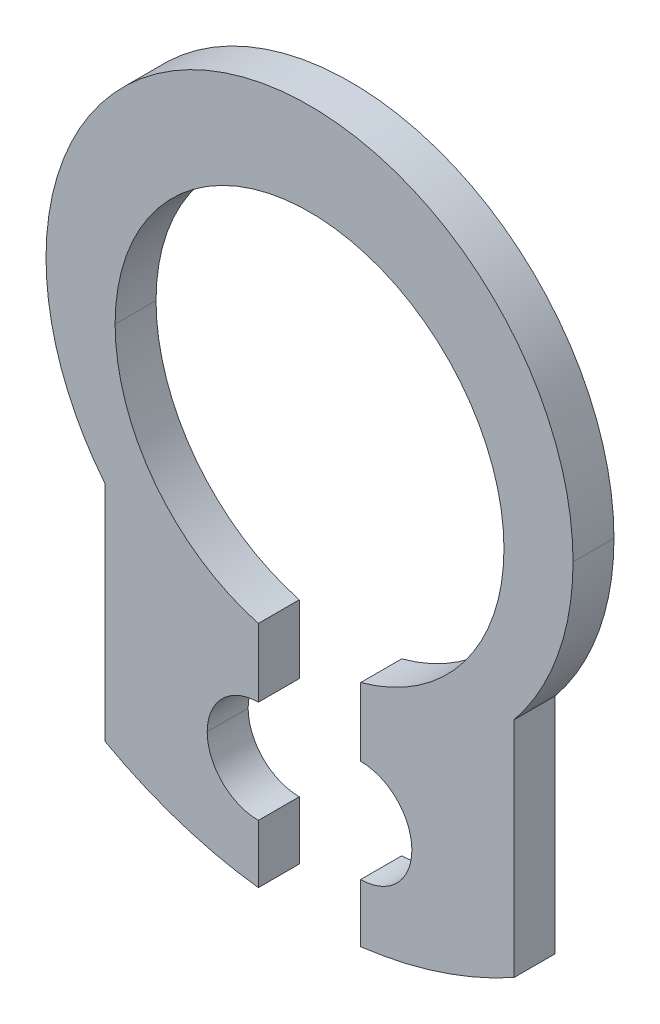
ISO-10303-21;
HEADER;
FILE_DESCRIPTION(('STEP AP214'),'2;1');
FILE_NAME('part.step','',(''),(''),'','','');
FILE_SCHEMA(('AUTOMOTIVE_DESIGN { 1 0 10303 214 1 1 1 1 }'));
ENDSEC;
DATA;
#1=APPLICATION_CONTEXT('core data for automotive mechanical design processes');
#2=APPLICATION_PROTOCOL_DEFINITION('international standard','automotive_design',2000,#1);
#3=PRODUCT_CONTEXT('',#1,'mechanical');
#4=PRODUCT('Part','Part','',(#3));
#5=PRODUCT_RELATED_PRODUCT_CATEGORY('part','',(#4));
#6=PRODUCT_DEFINITION_FORMATION('','',#4);
#7=PRODUCT_DEFINITION_CONTEXT('part definition',#1,'design');
#8=PRODUCT_DEFINITION('design','',#6,#7);
#9=PRODUCT_DEFINITION_SHAPE('','',#8);
#10=(LENGTH_UNIT() NAMED_UNIT(*) SI_UNIT(.MILLI.,.METRE.));
#11=(NAMED_UNIT(*) PLANE_ANGLE_UNIT() SI_UNIT($,.RADIAN.));
#12=(NAMED_UNIT(*) SI_UNIT($,.STERADIAN.) SOLID_ANGLE_UNIT());
#13=UNCERTAINTY_MEASURE_WITH_UNIT(LENGTH_MEASURE(1.E-05),#10,'distance_accuracy_value','');
#14=(GEOMETRIC_REPRESENTATION_CONTEXT(3) GLOBAL_UNCERTAINTY_ASSIGNED_CONTEXT((#13)) GLOBAL_UNIT_ASSIGNED_CONTEXT((#10,
#11,#12)) REPRESENTATION_CONTEXT('',''));
#15=CARTESIAN_POINT('',(0.,0.,0.));
#16=DIRECTION('',(0.,0.,1.));
#17=DIRECTION('',(1.,0.,0.));
#18=AXIS2_PLACEMENT_3D('',#15,#16,#17);
#19=CARTESIAN_POINT('',(0.,0.225,0.));
#20=DIRECTION('',(0.,0.,1.));
#21=DIRECTION('',(1.,0.,0.));
#22=AXIS2_PLACEMENT_3D('',#19,#20,#21);
#23=CYLINDRICAL_SURFACE('',#22,2.575);
#24=DIRECTION('',(0.,0.,1.));
#25=VECTOR('',#24,1.);
#26=CARTESIAN_POINT('',(2.575,0.225,0.));
#27=LINE('',#26,#25);
#28=CARTESIAN_POINT('',(2.575,0.225,0.));
#29=VERTEX_POINT('',#28);
#30=CARTESIAN_POINT('',(2.575,0.225,0.4));
#31=VERTEX_POINT('',#30);
#32=EDGE_CURVE('E373',#29,#31,#27,.T.);
#33=ORIENTED_EDGE('',*,*,#32,.T.);
#34=CARTESIAN_POINT('',(0.,0.225,0.4));
#35=DIRECTION('',(0.,0.,-1.));
#36=DIRECTION('',(1.,0.,0.));
#37=AXIS2_PLACEMENT_3D('',#34,#35,#36);
#38=CIRCLE('',#37,2.575);
#39=CARTESIAN_POINT('',(2.,-1.39692015833086,0.4));
#40=VERTEX_POINT('',#39);
#41=EDGE_CURVE('E245',#31,#40,#38,.T.);
#42=ORIENTED_EDGE('',*,*,#41,.T.);
#43=DIRECTION('',(0.,0.,1.));
#44=VECTOR('',#43,1.);
#45=CARTESIAN_POINT('',(2.,-1.39692015833086,0.));
#46=LINE('',#45,#44);
#47=CARTESIAN_POINT('',(2.,-1.39692015833086,0.));
#48=VERTEX_POINT('',#47);
#49=EDGE_CURVE('E24',#48,#40,#46,.T.);
#50=ORIENTED_EDGE('',*,*,#49,.F.);
#51=CARTESIAN_POINT('',(0.,0.225,0.));
#52=DIRECTION('',(0.,0.,1.));
#53=DIRECTION('',(1.,0.,0.));
#54=AXIS2_PLACEMENT_3D('',#51,#52,#53);
#55=CIRCLE('',#54,2.575);
#56=EDGE_CURVE('E326',#48,#29,#55,.T.);
#57=ORIENTED_EDGE('',*,*,#56,.T.);
#58=EDGE_LOOP('',(#33,#42,#50,#57));
#59=FACE_BOUND('',#58,.T.);
#60=ADVANCED_FACE('F16',(#59),#23,.T.);
#61=CARTESIAN_POINT('',(-2.,-2.48801309598276,0.));
#62=DIRECTION('',(-1.,0.,0.));
#63=DIRECTION('',(0.,1.,0.));
#64=AXIS2_PLACEMENT_3D('',#61,#62,#63);
#65=PLANE('',#64);
#66=DIRECTION('',(0.,1.,0.));
#67=VECTOR('',#66,1.);
#68=CARTESIAN_POINT('',(-2.,-3.57910603363466,0.4));
#69=LINE('',#68,#67);
#70=CARTESIAN_POINT('',(-2.,-3.57910603363466,0.4));
#71=VERTEX_POINT('',#70);
#72=CARTESIAN_POINT('',(-2.,-1.39692015833086,0.4));
#73=VERTEX_POINT('',#72);
#74=EDGE_CURVE('E241',#71,#73,#69,.T.);
#75=ORIENTED_EDGE('',*,*,#74,.T.);
#76=DIRECTION('',(0.,0.,1.));
#77=VECTOR('',#76,1.);
#78=CARTESIAN_POINT('',(-2.,-1.39692015833086,0.));
#79=LINE('',#78,#77);
#80=CARTESIAN_POINT('',(-2.,-1.39692015833086,0.));
#81=VERTEX_POINT('',#80);
#82=EDGE_CURVE('E377',#81,#73,#79,.T.);
#83=ORIENTED_EDGE('',*,*,#82,.F.);
#84=DIRECTION('',(0.,1.,0.));
#85=VECTOR('',#84,1.);
#86=CARTESIAN_POINT('',(-2.,-3.57910603363466,0.));
#87=LINE('',#86,#85);
#88=CARTESIAN_POINT('',(-2.,-3.57910603363466,0.));
#89=VERTEX_POINT('',#88);
#90=EDGE_CURVE('E253',#89,#81,#87,.T.);
#91=ORIENTED_EDGE('',*,*,#90,.F.);
#92=DIRECTION('',(0.,0.,1.));
#93=VECTOR('',#92,1.);
#94=CARTESIAN_POINT('',(-2.,-3.57910603363466,0.));
#95=LINE('',#94,#93);
#96=EDGE_CURVE('E10',#89,#71,#95,.T.);
#97=ORIENTED_EDGE('',*,*,#96,.T.);
#98=EDGE_LOOP('',(#75,#83,#91,#97));
#99=FACE_BOUND('',#98,.T.);
#100=ADVANCED_FACE('F456',(#99),#65,.T.);
#101=CARTESIAN_POINT('',(0.,0.,0.));
#102=DIRECTION('',(0.,0.,1.));
#103=DIRECTION('',(1.,0.,0.));
#104=AXIS2_PLACEMENT_3D('',#101,#102,#103);
#105=CYLINDRICAL_SURFACE('',#104,4.1);
#106=DIRECTION('',(0.,0.,1.));
#107=VECTOR('',#106,1.);
#108=CARTESIAN_POINT('',(-0.5,-4.06939798987516,0.2));
#109=LINE('',#108,#107);
#110=CARTESIAN_POINT('',(-0.5,-4.06939798987516,0.));
#111=VERTEX_POINT('',#110);
#112=CARTESIAN_POINT('',(-0.5,-4.06939798987516,0.4));
#113=VERTEX_POINT('',#112);
#114=EDGE_CURVE('E335',#111,#113,#109,.T.);
#115=ORIENTED_EDGE('',*,*,#114,.T.);
#116=CARTESIAN_POINT('',(0.,0.,0.4));
#117=DIRECTION('',(0.,0.,-1.));
#118=DIRECTION('',(1.,0.,0.));
#119=AXIS2_PLACEMENT_3D('',#116,#117,#118);
#120=CIRCLE('',#119,4.1);
#121=EDGE_CURVE('E244',#113,#71,#120,.T.);
#122=ORIENTED_EDGE('',*,*,#121,.T.);
#123=ORIENTED_EDGE('',*,*,#96,.F.);
#124=CARTESIAN_POINT('',(0.,0.,0.));
#125=DIRECTION('',(0.,0.,1.));
#126=DIRECTION('',(1.,0.,0.));
#127=AXIS2_PLACEMENT_3D('',#124,#125,#126);
#128=CIRCLE('',#127,4.1);
#129=EDGE_CURVE('E249',#89,#111,#128,.T.);
#130=ORIENTED_EDGE('',*,*,#129,.T.);
#131=EDGE_LOOP('',(#115,#122,#123,#130));
#132=FACE_BOUND('',#131,.T.);
#133=ADVANCED_FACE('F453',(#132),#105,.T.);
#134=CARTESIAN_POINT('',(2.,-2.48801309598276,0.));
#135=DIRECTION('',(1.,0.,0.));
#136=DIRECTION('',(0.,1.,0.));
#137=AXIS2_PLACEMENT_3D('',#134,#135,#136);
#138=PLANE('',#137);
#139=DIRECTION('',(0.,-1.,0.));
#140=VECTOR('',#139,1.);
#141=CARTESIAN_POINT('',(2.,-3.57910603363466,0.4));
#142=LINE('',#141,#140);
#143=CARTESIAN_POINT('',(2.,-3.57910603363465,0.4));
#144=VERTEX_POINT('',#143);
#145=EDGE_CURVE('E290',#40,#144,#142,.T.);
#146=ORIENTED_EDGE('',*,*,#145,.T.);
#147=DIRECTION('',(0.,0.,1.));
#148=VECTOR('',#147,1.);
#149=CARTESIAN_POINT('',(2.,-3.57910603363465,0.));
#150=LINE('',#149,#148);
#151=CARTESIAN_POINT('',(2.,-3.57910603363465,0.));
#152=VERTEX_POINT('',#151);
#153=EDGE_CURVE('E36',#152,#144,#150,.T.);
#154=ORIENTED_EDGE('',*,*,#153,.F.);
#155=DIRECTION('',(0.,1.,0.));
#156=VECTOR('',#155,1.);
#157=CARTESIAN_POINT('',(2.,-3.57910603363466,0.));
#158=LINE('',#157,#156);
#159=EDGE_CURVE('E329',#152,#48,#158,.T.);
#160=ORIENTED_EDGE('',*,*,#159,.T.);
#161=ORIENTED_EDGE('',*,*,#49,.T.);
#162=EDGE_LOOP('',(#146,#154,#160,#161));
#163=FACE_BOUND('',#162,.T.);
#164=ADVANCED_FACE('F445',(#163),#138,.T.);
#165=CARTESIAN_POINT('',(0.,0.,0.));
#166=DIRECTION('',(0.,0.,1.));
#167=DIRECTION('',(1.,0.,0.));
#168=AXIS2_PLACEMENT_3D('',#165,#166,#167);
#169=CYLINDRICAL_SURFACE('',#168,4.1);
#170=DIRECTION('',(0.,0.,-1.));
#171=VECTOR('',#170,1.);
#172=CARTESIAN_POINT('',(0.5,-4.06939798987516,0.2));
#173=LINE('',#172,#171);
#174=CARTESIAN_POINT('',(0.5,-4.06939798987516,0.4));
#175=VERTEX_POINT('',#174);
#176=CARTESIAN_POINT('',(0.5,-4.06939798987516,0.));
#177=VERTEX_POINT('',#176);
#178=EDGE_CURVE('E309',#175,#177,#173,.T.);
#179=ORIENTED_EDGE('',*,*,#178,.T.);
#180=CARTESIAN_POINT('',(0.,0.,0.));
#181=DIRECTION('',(0.,0.,1.));
#182=DIRECTION('',(1.,0.,0.));
#183=AXIS2_PLACEMENT_3D('',#180,#181,#182);
#184=CIRCLE('',#183,4.1);
#185=EDGE_CURVE('E332',#177,#152,#184,.T.);
#186=ORIENTED_EDGE('',*,*,#185,.T.);
#187=ORIENTED_EDGE('',*,*,#153,.T.);
#188=CARTESIAN_POINT('',(0.,0.,0.4));
#189=DIRECTION('',(0.,0.,-1.));
#190=DIRECTION('',(1.,0.,0.));
#191=AXIS2_PLACEMENT_3D('',#188,#189,#190);
#192=CIRCLE('',#191,4.1);
#193=EDGE_CURVE('E286',#144,#175,#192,.T.);
#194=ORIENTED_EDGE('',*,*,#193,.T.);
#195=EDGE_LOOP('',(#179,#186,#187,#194));
#196=FACE_BOUND('',#195,.T.);
#197=ADVANCED_FACE('F443',(#196),#169,.T.);
#198=CARTESIAN_POINT('',(0.,0.,0.2));
#199=DIRECTION('',(0.,0.,1.));
#200=DIRECTION('',(1.,0.,0.));
#201=AXIS2_PLACEMENT_3D('',#198,#199,#200);
#202=CYLINDRICAL_SURFACE('',#201,1.9);
#203=DIRECTION('',(0.,0.,-1.));
#204=VECTOR('',#203,1.);
#205=CARTESIAN_POINT('',(1.9,0.,0.2));
#206=LINE('',#205,#204);
#207=CARTESIAN_POINT('',(1.9,0.,0.4));
#208=VERTEX_POINT('',#207);
#209=CARTESIAN_POINT('',(1.9,0.,0.));
#210=VERTEX_POINT('',#209);
#211=EDGE_CURVE('E240',#208,#210,#206,.T.);
#212=ORIENTED_EDGE('',*,*,#211,.T.);
#213=CARTESIAN_POINT('',(0.,0.,0.));
#214=DIRECTION('',(0.,0.,1.));
#215=DIRECTION('',(1.,0.,0.));
#216=AXIS2_PLACEMENT_3D('',#213,#214,#215);
#217=CIRCLE('',#216,1.9);
#218=CARTESIAN_POINT('',(0.5,-1.83303027798234,0.));
#219=VERTEX_POINT('',#218);
#220=EDGE_CURVE('E317',#219,#210,#217,.T.);
#221=ORIENTED_EDGE('',*,*,#220,.F.);
#222=DIRECTION('',(0.,0.,1.));
#223=VECTOR('',#222,1.);
#224=CARTESIAN_POINT('',(0.5,-1.83303027798234,0.2));
#225=LINE('',#224,#223);
#226=CARTESIAN_POINT('',(0.5,-1.83303027798234,0.4));
#227=VERTEX_POINT('',#226);
#228=EDGE_CURVE('E337',#219,#227,#225,.T.);
#229=ORIENTED_EDGE('',*,*,#228,.T.);
#230=CARTESIAN_POINT('',(0.,0.,0.4));
#231=DIRECTION('',(0.,0.,-1.));
#232=DIRECTION('',(1.,0.,0.));
#233=AXIS2_PLACEMENT_3D('',#230,#231,#232);
#234=CIRCLE('',#233,1.9);
#235=EDGE_CURVE('E274',#208,#227,#234,.T.);
#236=ORIENTED_EDGE('',*,*,#235,.F.);
#237=EDGE_LOOP('',(#212,#221,#229,#236));
#238=FACE_BOUND('',#237,.T.);
#239=ADVANCED_FACE('F426',(#238),#202,.F.);
#240=CARTESIAN_POINT('',(0.5,-2.875,0.2));
#241=DIRECTION('',(-1.,0.,0.));
#242=DIRECTION('',(0.,0.,1.));
#243=AXIS2_PLACEMENT_3D('',#240,#241,#242);
#244=PLANE('',#243);
#245=DIRECTION('',(0.,0.,1.));
#246=VECTOR('',#245,1.);
#247=CARTESIAN_POINT('',(0.5,-2.5,0.2));
#248=LINE('',#247,#246);
#249=CARTESIAN_POINT('',(0.5,-2.5,0.));
#250=VERTEX_POINT('',#249);
#251=CARTESIAN_POINT('',(0.5,-2.5,0.4));
#252=VERTEX_POINT('',#251);
#253=EDGE_CURVE('E267',#250,#252,#248,.T.);
#254=ORIENTED_EDGE('',*,*,#253,.T.);
#255=DIRECTION('',(0.,-1.,0.));
#256=VECTOR('',#255,1.);
#257=CARTESIAN_POINT('',(0.5,-1.85976178352986,0.4));
#258=LINE('',#257,#256);
#259=EDGE_CURVE('E270',#227,#252,#258,.T.);
#260=ORIENTED_EDGE('',*,*,#259,.F.);
#261=ORIENTED_EDGE('',*,*,#228,.F.);
#262=DIRECTION('',(0.,1.,0.));
#263=VECTOR('',#262,1.);
#264=CARTESIAN_POINT('',(0.5,-1.85976178352986,0.));
#265=LINE('',#264,#263);
#266=EDGE_CURVE('E312',#250,#219,#265,.T.);
#267=ORIENTED_EDGE('',*,*,#266,.F.);
#268=EDGE_LOOP('',(#254,#260,#261,#267));
#269=FACE_BOUND('',#268,.T.);
#270=ADVANCED_FACE('F431',(#269),#244,.T.);
#271=CARTESIAN_POINT('',(-0.5,-2.875,0.2));
#272=DIRECTION('',(1.,0.,0.));
#273=DIRECTION('',(0.,1.,0.));
#274=AXIS2_PLACEMENT_3D('',#271,#272,#273);
#275=PLANE('',#274);
#276=DIRECTION('',(0.,0.,-1.));
#277=VECTOR('',#276,1.);
#278=CARTESIAN_POINT('',(-0.5,-2.5,0.2));
#279=LINE('',#278,#277);
#280=CARTESIAN_POINT('',(-0.5,-2.5,0.4));
#281=VERTEX_POINT('',#280);
#282=CARTESIAN_POINT('',(-0.5,-2.5,0.));
#283=VERTEX_POINT('',#282);
#284=EDGE_CURVE('E203',#281,#283,#279,.T.);
#285=ORIENTED_EDGE('',*,*,#284,.T.);
#286=DIRECTION('',(0.,-1.,0.));
#287=VECTOR('',#286,1.);
#288=CARTESIAN_POINT('',(-0.5,-1.85976178352986,0.));
#289=LINE('',#288,#287);
#290=CARTESIAN_POINT('',(-0.5,-1.83303027798234,0.));
#291=VERTEX_POINT('',#290);
#292=EDGE_CURVE('E320',#291,#283,#289,.T.);
#293=ORIENTED_EDGE('',*,*,#292,.F.);
#294=DIRECTION('',(0.,0.,-1.));
#295=VECTOR('',#294,1.);
#296=CARTESIAN_POINT('',(-0.5,-1.83303027798234,0.2));
#297=LINE('',#296,#295);
#298=CARTESIAN_POINT('',(-0.5,-1.83303027798234,0.4));
#299=VERTEX_POINT('',#298);
#300=EDGE_CURVE('E227',#299,#291,#297,.T.);
#301=ORIENTED_EDGE('',*,*,#300,.F.);
#302=DIRECTION('',(0.,1.,0.));
#303=VECTOR('',#302,1.);
#304=CARTESIAN_POINT('',(-0.5,-1.85976178352986,0.4));
#305=LINE('',#304,#303);
#306=EDGE_CURVE('E195',#281,#299,#305,.T.);
#307=ORIENTED_EDGE('',*,*,#306,.F.);
#308=EDGE_LOOP('',(#285,#293,#301,#307));
#309=FACE_BOUND('',#308,.T.);
#310=ADVANCED_FACE('F416',(#309),#275,.T.);
#311=CARTESIAN_POINT('',(-0.5,-2.875,0.2));
#312=DIRECTION('',(1.,0.,0.));
#313=DIRECTION('',(0.,1.,0.));
#314=AXIS2_PLACEMENT_3D('',#311,#312,#313);
#315=PLANE('',#314);
#316=DIRECTION('',(0.,0.,1.));
#317=VECTOR('',#316,1.);
#318=CARTESIAN_POINT('',(-0.5,-3.5,0.2));
#319=LINE('',#318,#317);
#320=CARTESIAN_POINT('',(-0.5,-3.5,0.));
#321=VERTEX_POINT('',#320);
#322=CARTESIAN_POINT('',(-0.5,-3.5,0.4));
#323=VERTEX_POINT('',#322);
#324=EDGE_CURVE('E313',#321,#323,#319,.T.);
#325=ORIENTED_EDGE('',*,*,#324,.T.);
#326=DIRECTION('',(0.,1.,0.));
#327=VECTOR('',#326,1.);
#328=CARTESIAN_POINT('',(-0.5,-1.85976178352986,0.4));
#329=LINE('',#328,#327);
#330=EDGE_CURVE('E190',#113,#323,#329,.T.);
#331=ORIENTED_EDGE('',*,*,#330,.F.);
#332=ORIENTED_EDGE('',*,*,#114,.F.);
#333=DIRECTION('',(0.,-1.,0.));
#334=VECTOR('',#333,1.);
#335=CARTESIAN_POINT('',(-0.5,-1.85976178352986,0.));
#336=LINE('',#335,#334);
#337=EDGE_CURVE('E254',#321,#111,#336,.T.);
#338=ORIENTED_EDGE('',*,*,#337,.F.);
#339=EDGE_LOOP('',(#325,#331,#332,#338));
#340=FACE_BOUND('',#339,.T.);
#341=ADVANCED_FACE('F413',(#340),#315,.T.);
#342=CARTESIAN_POINT('',(0.,-0.844523567059723,0.));
#343=DIRECTION('',(0.,0.,1.));
#344=DIRECTION('',(1.,0.,0.));
#345=AXIS2_PLACEMENT_3D('',#342,#343,#344);
#346=PLANE('',#345);
#347=CARTESIAN_POINT('',(0.5,-3.,0.));
#348=DIRECTION('',(0.,0.,1.));
#349=DIRECTION('',(1.,0.,0.));
#350=AXIS2_PLACEMENT_3D('',#347,#348,#349);
#351=CIRCLE('',#350,0.5);
#352=CARTESIAN_POINT('',(0.5,-3.5,0.));
#353=VERTEX_POINT('',#352);
#354=CARTESIAN_POINT('',(1.,-3.,0.));
#355=VERTEX_POINT('',#354);
#356=EDGE_CURVE('E266',#353,#355,#351,.T.);
#357=ORIENTED_EDGE('',*,*,#356,.T.);
#358=CARTESIAN_POINT('',(0.5,-3.,0.));
#359=DIRECTION('',(0.,0.,1.));
#360=DIRECTION('',(1.,0.,0.));
#361=AXIS2_PLACEMENT_3D('',#358,#359,#360);
#362=CIRCLE('',#361,0.5);
#363=EDGE_CURVE('E262',#355,#250,#362,.T.);
#364=ORIENTED_EDGE('',*,*,#363,.T.);
#365=ORIENTED_EDGE('',*,*,#266,.T.);
#366=ORIENTED_EDGE('',*,*,#220,.T.);
#367=CARTESIAN_POINT('',(0.,0.,0.));
#368=DIRECTION('',(0.,0.,1.));
#369=DIRECTION('',(1.,0.,0.));
#370=AXIS2_PLACEMENT_3D('',#367,#368,#369);
#371=CIRCLE('',#370,1.9);
#372=CARTESIAN_POINT('',(-1.9,0.,0.));
#373=VERTEX_POINT('',#372);
#374=EDGE_CURVE('E213',#210,#373,#371,.T.);
#375=ORIENTED_EDGE('',*,*,#374,.T.);
#376=CARTESIAN_POINT('',(0.,0.,0.));
#377=DIRECTION('',(0.,0.,1.));
#378=DIRECTION('',(1.,0.,0.));
#379=AXIS2_PLACEMENT_3D('',#376,#377,#378);
#380=CIRCLE('',#379,1.9);
#381=EDGE_CURVE('E230',#373,#291,#380,.T.);
#382=ORIENTED_EDGE('',*,*,#381,.T.);
#383=ORIENTED_EDGE('',*,*,#292,.T.);
#384=CARTESIAN_POINT('',(-0.5,-3.,0.));
#385=DIRECTION('',(0.,0.,1.));
#386=DIRECTION('',(1.,0.,0.));
#387=AXIS2_PLACEMENT_3D('',#384,#385,#386);
#388=CIRCLE('',#387,0.5);
#389=CARTESIAN_POINT('',(-1.,-3.,0.));
#390=VERTEX_POINT('',#389);
#391=EDGE_CURVE('E212',#283,#390,#388,.T.);
#392=ORIENTED_EDGE('',*,*,#391,.T.);
#393=CARTESIAN_POINT('',(-0.5,-3.,0.));
#394=DIRECTION('',(0.,0.,1.));
#395=DIRECTION('',(1.,0.,0.));
#396=AXIS2_PLACEMENT_3D('',#393,#394,#395);
#397=CIRCLE('',#396,0.5);
#398=EDGE_CURVE('E209',#390,#321,#397,.T.);
#399=ORIENTED_EDGE('',*,*,#398,.T.);
#400=ORIENTED_EDGE('',*,*,#337,.T.);
#401=ORIENTED_EDGE('',*,*,#129,.F.);
#402=ORIENTED_EDGE('',*,*,#90,.T.);
#403=CARTESIAN_POINT('',(0.,0.225,0.));
#404=DIRECTION('',(0.,0.,1.));
#405=DIRECTION('',(1.,0.,0.));
#406=AXIS2_PLACEMENT_3D('',#403,#404,#405);
#407=CIRCLE('',#406,2.575);
#408=CARTESIAN_POINT('',(-2.575,0.225,0.));
#409=VERTEX_POINT('',#408);
#410=EDGE_CURVE('E394',#409,#81,#407,.T.);
#411=ORIENTED_EDGE('',*,*,#410,.F.);
#412=CARTESIAN_POINT('',(0.,0.225,0.));
#413=DIRECTION('',(0.,0.,1.));
#414=DIRECTION('',(1.,0.,0.));
#415=AXIS2_PLACEMENT_3D('',#412,#413,#414);
#416=CIRCLE('',#415,2.575);
#417=EDGE_CURVE('E363',#29,#409,#416,.T.);
#418=ORIENTED_EDGE('',*,*,#417,.F.);
#419=ORIENTED_EDGE('',*,*,#56,.F.);
#420=ORIENTED_EDGE('',*,*,#159,.F.);
#421=ORIENTED_EDGE('',*,*,#185,.F.);
#422=DIRECTION('',(0.,1.,0.));
#423=VECTOR('',#422,1.);
#424=CARTESIAN_POINT('',(0.5,-1.85976178352986,0.));
#425=LINE('',#424,#423);
#426=EDGE_CURVE('E273',#177,#353,#425,.T.);
#427=ORIENTED_EDGE('',*,*,#426,.T.);
#428=EDGE_LOOP('',(#357,#364,#365,#366,#375,#382,#383,#392,#399,#400,#401,#402,#411,#418,#419,
#420,#421,#427));
#429=FACE_BOUND('',#428,.T.);
#430=ADVANCED_FACE('F395',(#429),#346,.F.);
#431=CARTESIAN_POINT('',(-0.5,-3.,0.2));
#432=DIRECTION('',(0.,0.,1.));
#433=DIRECTION('',(1.,0.,0.));
#434=AXIS2_PLACEMENT_3D('',#431,#432,#433);
#435=CYLINDRICAL_SURFACE('',#434,0.5);
#436=DIRECTION('',(0.,0.,1.));
#437=VECTOR('',#436,1.);
#438=CARTESIAN_POINT('',(-1.,-3.,0.2));
#439=LINE('',#438,#437);
#440=CARTESIAN_POINT('',(-1.,-3.,0.4));
#441=VERTEX_POINT('',#440);
#442=EDGE_CURVE('E201',#390,#441,#439,.T.);
#443=ORIENTED_EDGE('',*,*,#442,.T.);
#444=CARTESIAN_POINT('',(-0.5,-3.,0.4));
#445=DIRECTION('',(0.,0.,-1.));
#446=DIRECTION('',(1.,0.,0.));
#447=AXIS2_PLACEMENT_3D('',#444,#445,#446);
#448=CIRCLE('',#447,0.5);
#449=EDGE_CURVE('E182',#323,#441,#448,.T.);
#450=ORIENTED_EDGE('',*,*,#449,.F.);
#451=ORIENTED_EDGE('',*,*,#324,.F.);
#452=ORIENTED_EDGE('',*,*,#398,.F.);
#453=EDGE_LOOP('',(#443,#450,#451,#452));
#454=FACE_BOUND('',#453,.T.);
#455=ADVANCED_FACE('F207',(#454),#435,.F.);
#456=CARTESIAN_POINT('',(0.5,-2.875,0.2));
#457=DIRECTION('',(-1.,0.,0.));
#458=DIRECTION('',(0.,0.,1.));
#459=AXIS2_PLACEMENT_3D('',#456,#457,#458);
#460=PLANE('',#459);
#461=DIRECTION('',(0.,0.,-1.));
#462=VECTOR('',#461,1.);
#463=CARTESIAN_POINT('',(0.5,-3.5,0.2));
#464=LINE('',#463,#462);
#465=CARTESIAN_POINT('',(0.5,-3.5,0.4));
#466=VERTEX_POINT('',#465);
#467=EDGE_CURVE('E236',#466,#353,#464,.T.);
#468=ORIENTED_EDGE('',*,*,#467,.T.);
#469=ORIENTED_EDGE('',*,*,#426,.F.);
#470=ORIENTED_EDGE('',*,*,#178,.F.);
#471=DIRECTION('',(0.,-1.,0.));
#472=VECTOR('',#471,1.);
#473=CARTESIAN_POINT('',(0.5,-1.85976178352986,0.4));
#474=LINE('',#473,#472);
#475=EDGE_CURVE('E235',#466,#175,#474,.T.);
#476=ORIENTED_EDGE('',*,*,#475,.F.);
#477=EDGE_LOOP('',(#468,#469,#470,#476));
#478=FACE_BOUND('',#477,.T.);
#479=ADVANCED_FACE('F441',(#478),#460,.T.);
#480=CARTESIAN_POINT('',(0.,-0.844523567059723,0.4));
#481=DIRECTION('',(0.,0.,1.));
#482=DIRECTION('',(1.,0.,0.));
#483=AXIS2_PLACEMENT_3D('',#480,#481,#482);
#484=PLANE('',#483);
#485=CARTESIAN_POINT('',(0.5,-3.,0.4));
#486=DIRECTION('',(0.,0.,-1.));
#487=DIRECTION('',(1.,0.,0.));
#488=AXIS2_PLACEMENT_3D('',#485,#486,#487);
#489=CIRCLE('',#488,0.5);
#490=CARTESIAN_POINT('',(1.,-3.,0.4));
#491=VERTEX_POINT('',#490);
#492=EDGE_CURVE('E261',#252,#491,#489,.T.);
#493=ORIENTED_EDGE('',*,*,#492,.T.);
#494=CARTESIAN_POINT('',(0.5,-3.,0.4));
#495=DIRECTION('',(0.,0.,-1.));
#496=DIRECTION('',(1.,0.,0.));
#497=AXIS2_PLACEMENT_3D('',#494,#495,#496);
#498=CIRCLE('',#497,0.5);
#499=EDGE_CURVE('E231',#491,#466,#498,.T.);
#500=ORIENTED_EDGE('',*,*,#499,.T.);
#501=ORIENTED_EDGE('',*,*,#475,.T.);
#502=ORIENTED_EDGE('',*,*,#193,.F.);
#503=ORIENTED_EDGE('',*,*,#145,.F.);
#504=ORIENTED_EDGE('',*,*,#41,.F.);
#505=CARTESIAN_POINT('',(0.,0.225,0.4));
#506=DIRECTION('',(0.,0.,-1.));
#507=DIRECTION('',(1.,0.,0.));
#508=AXIS2_PLACEMENT_3D('',#505,#506,#507);
#509=CIRCLE('',#508,2.575);
#510=CARTESIAN_POINT('',(-2.575,0.225,0.4));
#511=VERTEX_POINT('',#510);
#512=EDGE_CURVE('E354',#511,#31,#509,.T.);
#513=ORIENTED_EDGE('',*,*,#512,.F.);
#514=CARTESIAN_POINT('',(0.,0.225,0.4));
#515=DIRECTION('',(0.,0.,-1.));
#516=DIRECTION('',(1.,0.,0.));
#517=AXIS2_PLACEMENT_3D('',#514,#515,#516);
#518=CIRCLE('',#517,2.575);
#519=EDGE_CURVE('E380',#73,#511,#518,.T.);
#520=ORIENTED_EDGE('',*,*,#519,.F.);
#521=ORIENTED_EDGE('',*,*,#74,.F.);
#522=ORIENTED_EDGE('',*,*,#121,.F.);
#523=ORIENTED_EDGE('',*,*,#330,.T.);
#524=ORIENTED_EDGE('',*,*,#449,.T.);
#525=CARTESIAN_POINT('',(-0.5,-3.,0.4));
#526=DIRECTION('',(0.,0.,-1.));
#527=DIRECTION('',(1.,0.,0.));
#528=AXIS2_PLACEMENT_3D('',#525,#526,#527);
#529=CIRCLE('',#528,0.5);
#530=EDGE_CURVE('E186',#441,#281,#529,.T.);
#531=ORIENTED_EDGE('',*,*,#530,.T.);
#532=ORIENTED_EDGE('',*,*,#306,.T.);
#533=CARTESIAN_POINT('',(0.,0.,0.4));
#534=DIRECTION('',(0.,0.,-1.));
#535=DIRECTION('',(1.,0.,0.));
#536=AXIS2_PLACEMENT_3D('',#533,#534,#535);
#537=CIRCLE('',#536,1.9);
#538=CARTESIAN_POINT('',(-1.9,0.,0.4));
#539=VERTEX_POINT('',#538);
#540=EDGE_CURVE('E225',#299,#539,#537,.T.);
#541=ORIENTED_EDGE('',*,*,#540,.T.);
#542=CARTESIAN_POINT('',(0.,0.,0.4));
#543=DIRECTION('',(0.,0.,-1.));
#544=DIRECTION('',(1.,0.,0.));
#545=AXIS2_PLACEMENT_3D('',#542,#543,#544);
#546=CIRCLE('',#545,1.9);
#547=EDGE_CURVE('E221',#539,#208,#546,.T.);
#548=ORIENTED_EDGE('',*,*,#547,.T.);
#549=ORIENTED_EDGE('',*,*,#235,.T.);
#550=ORIENTED_EDGE('',*,*,#259,.T.);
#551=EDGE_LOOP('',(#493,#500,#501,#502,#503,#504,#513,#520,#521,#522,#523,#524,#531,#532,#541,
#548,#549,#550));
#552=FACE_BOUND('',#551,.T.);
#553=ADVANCED_FACE('F185',(#552),#484,.T.);
#554=CARTESIAN_POINT('',(0.5,-3.,0.2));
#555=DIRECTION('',(0.,0.,1.));
#556=DIRECTION('',(1.,0.,0.));
#557=AXIS2_PLACEMENT_3D('',#554,#555,#556);
#558=CYLINDRICAL_SURFACE('',#557,0.5);
#559=DIRECTION('',(0.,0.,-1.));
#560=VECTOR('',#559,1.);
#561=CARTESIAN_POINT('',(1.,-3.,0.2));
#562=LINE('',#561,#560);
#563=EDGE_CURVE('E205',#491,#355,#562,.T.);
#564=ORIENTED_EDGE('',*,*,#563,.T.);
#565=ORIENTED_EDGE('',*,*,#356,.F.);
#566=ORIENTED_EDGE('',*,*,#467,.F.);
#567=ORIENTED_EDGE('',*,*,#499,.F.);
#568=EDGE_LOOP('',(#564,#565,#566,#567));
#569=FACE_BOUND('',#568,.T.);
#570=ADVANCED_FACE('F437',(#569),#558,.F.);
#571=CARTESIAN_POINT('',(0.5,-3.,0.2));
#572=DIRECTION('',(0.,0.,1.));
#573=DIRECTION('',(1.,0.,0.));
#574=AXIS2_PLACEMENT_3D('',#571,#572,#573);
#575=CYLINDRICAL_SURFACE('',#574,0.5);
#576=ORIENTED_EDGE('',*,*,#563,.F.);
#577=ORIENTED_EDGE('',*,*,#492,.F.);
#578=ORIENTED_EDGE('',*,*,#253,.F.);
#579=ORIENTED_EDGE('',*,*,#363,.F.);
#580=EDGE_LOOP('',(#576,#577,#578,#579));
#581=FACE_BOUND('',#580,.T.);
#582=ADVANCED_FACE('F434',(#581),#575,.F.);
#583=CARTESIAN_POINT('',(-0.5,-3.,0.2));
#584=DIRECTION('',(0.,0.,1.));
#585=DIRECTION('',(1.,0.,0.));
#586=AXIS2_PLACEMENT_3D('',#583,#584,#585);
#587=CYLINDRICAL_SURFACE('',#586,0.5);
#588=ORIENTED_EDGE('',*,*,#442,.F.);
#589=ORIENTED_EDGE('',*,*,#391,.F.);
#590=ORIENTED_EDGE('',*,*,#284,.F.);
#591=ORIENTED_EDGE('',*,*,#530,.F.);
#592=EDGE_LOOP('',(#588,#589,#590,#591));
#593=FACE_BOUND('',#592,.T.);
#594=ADVANCED_FACE('F199',(#593),#587,.F.);
#595=CARTESIAN_POINT('',(0.,0.,0.2));
#596=DIRECTION('',(0.,0.,1.));
#597=DIRECTION('',(1.,0.,0.));
#598=AXIS2_PLACEMENT_3D('',#595,#596,#597);
#599=CYLINDRICAL_SURFACE('',#598,1.9);
#600=ORIENTED_EDGE('',*,*,#211,.F.);
#601=ORIENTED_EDGE('',*,*,#547,.F.);
#602=DIRECTION('',(0.,0.,1.));
#603=VECTOR('',#602,1.);
#604=CARTESIAN_POINT('',(-1.9,0.,0.2));
#605=LINE('',#604,#603);
#606=EDGE_CURVE('E351',#373,#539,#605,.T.);
#607=ORIENTED_EDGE('',*,*,#606,.F.);
#608=ORIENTED_EDGE('',*,*,#374,.F.);
#609=EDGE_LOOP('',(#600,#601,#607,#608));
#610=FACE_BOUND('',#609,.T.);
#611=ADVANCED_FACE('F425',(#610),#599,.F.);
#612=CARTESIAN_POINT('',(0.,0.,0.2));
#613=DIRECTION('',(0.,0.,1.));
#614=DIRECTION('',(1.,0.,0.));
#615=AXIS2_PLACEMENT_3D('',#612,#613,#614);
#616=CYLINDRICAL_SURFACE('',#615,1.9);
#617=ORIENTED_EDGE('',*,*,#606,.T.);
#618=ORIENTED_EDGE('',*,*,#540,.F.);
#619=ORIENTED_EDGE('',*,*,#300,.T.);
#620=ORIENTED_EDGE('',*,*,#381,.F.);
#621=EDGE_LOOP('',(#617,#618,#619,#620));
#622=FACE_BOUND('',#621,.T.);
#623=ADVANCED_FACE('F422',(#622),#616,.F.);
#624=CARTESIAN_POINT('',(0.,0.225,0.));
#625=DIRECTION('',(0.,0.,1.));
#626=DIRECTION('',(1.,0.,0.));
#627=AXIS2_PLACEMENT_3D('',#624,#625,#626);
#628=CYLINDRICAL_SURFACE('',#627,2.575);
#629=ORIENTED_EDGE('',*,*,#32,.F.);
#630=ORIENTED_EDGE('',*,*,#417,.T.);
#631=DIRECTION('',(0.,0.,-1.));
#632=VECTOR('',#631,1.);
#633=CARTESIAN_POINT('',(-2.575,0.225,0.));
#634=LINE('',#633,#632);
#635=EDGE_CURVE('E391',#511,#409,#634,.T.);
#636=ORIENTED_EDGE('',*,*,#635,.F.);
#637=ORIENTED_EDGE('',*,*,#512,.T.);
#638=EDGE_LOOP('',(#629,#630,#636,#637));
#639=FACE_BOUND('',#638,.T.);
#640=ADVANCED_FACE('F388',(#639),#628,.T.);
#641=CARTESIAN_POINT('',(0.,0.225,0.));
#642=DIRECTION('',(0.,0.,1.));
#643=DIRECTION('',(1.,0.,0.));
#644=AXIS2_PLACEMENT_3D('',#641,#642,#643);
#645=CYLINDRICAL_SURFACE('',#644,2.575);
#646=ORIENTED_EDGE('',*,*,#635,.T.);
#647=ORIENTED_EDGE('',*,*,#410,.T.);
#648=ORIENTED_EDGE('',*,*,#82,.T.);
#649=ORIENTED_EDGE('',*,*,#519,.T.);
#650=EDGE_LOOP('',(#646,#647,#648,#649));
#651=FACE_BOUND('',#650,.T.);
#652=ADVANCED_FACE('F402',(#651),#645,.T.);
#653=CLOSED_SHELL('',(#60,#100,#133,#164,#197,#239,#270,#310,#341,#430,#455,#479,#553,#570,#582,
#594,#611,#623,#640,#652));
#654=MANIFOLD_SOLID_BREP('B1',#653);
#655=ADVANCED_BREP_SHAPE_REPRESENTATION('',(#18,#654),#14);
#656=SHAPE_DEFINITION_REPRESENTATION(#9,#655);
ENDSEC;
END-ISO-10303-21;
